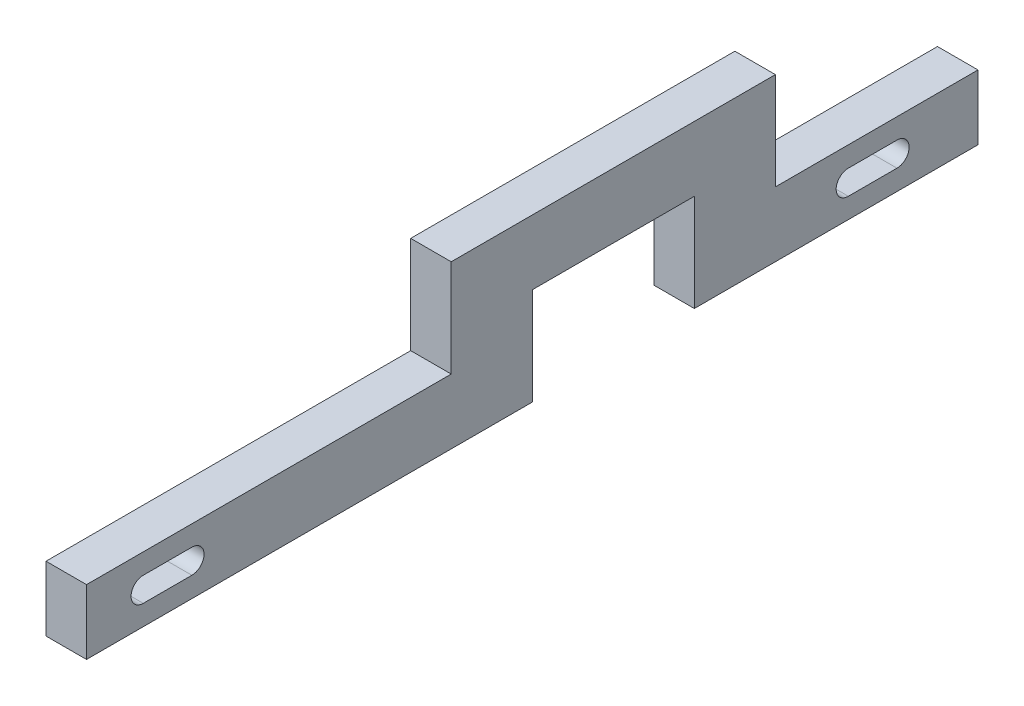
ISO-10303-21;
HEADER;
FILE_DESCRIPTION(('STEP AP214'),'2;1');
FILE_NAME('part.step','',(''),(''),'','','');
FILE_SCHEMA(('AUTOMOTIVE_DESIGN { 1 0 10303 214 1 1 1 1 }'));
ENDSEC;
DATA;
#1=APPLICATION_CONTEXT('core data for automotive mechanical design processes');
#2=APPLICATION_PROTOCOL_DEFINITION('international standard','automotive_design',2000,#1);
#3=PRODUCT_CONTEXT('',#1,'mechanical');
#4=PRODUCT('Part','Part','',(#3));
#5=PRODUCT_RELATED_PRODUCT_CATEGORY('part','',(#4));
#6=PRODUCT_DEFINITION_FORMATION('','',#4);
#7=PRODUCT_DEFINITION_CONTEXT('part definition',#1,'design');
#8=PRODUCT_DEFINITION('design','',#6,#7);
#9=PRODUCT_DEFINITION_SHAPE('','',#8);
#10=(LENGTH_UNIT() NAMED_UNIT(*) SI_UNIT(.MILLI.,.METRE.));
#11=(NAMED_UNIT(*) PLANE_ANGLE_UNIT() SI_UNIT($,.RADIAN.));
#12=(NAMED_UNIT(*) SI_UNIT($,.STERADIAN.) SOLID_ANGLE_UNIT());
#13=UNCERTAINTY_MEASURE_WITH_UNIT(LENGTH_MEASURE(1.E-05),#10,'distance_accuracy_value','');
#14=(GEOMETRIC_REPRESENTATION_CONTEXT(3) GLOBAL_UNCERTAINTY_ASSIGNED_CONTEXT((#13)) GLOBAL_UNIT_ASSIGNED_CONTEXT((#10,
#11,#12)) REPRESENTATION_CONTEXT('',''));
#15=CARTESIAN_POINT('',(0.,0.,0.));
#16=DIRECTION('',(0.,0.,1.));
#17=DIRECTION('',(1.,0.,0.));
#18=AXIS2_PLACEMENT_3D('',#15,#16,#17);
#19=CARTESIAN_POINT('',(5.,0.,0.));
#20=DIRECTION('',(1.,0.,0.));
#21=DIRECTION('',(0.,0.,-1.));
#22=AXIS2_PLACEMENT_3D('',#19,#20,#21);
#23=PLANE('',#22);
#24=DIRECTION('',(0.,-1.,0.));
#25=VECTOR('',#24,1.);
#26=CARTESIAN_POINT('',(5.,7.81238305983361,30.4077186591871));
#27=LINE('',#26,#25);
#28=CARTESIAN_POINT('',(5.,7.81238305983361,30.4077186591871));
#29=VERTEX_POINT('',#28);
#30=CARTESIAN_POINT('',(5.,-0.187616940166392,30.4077186591871));
#31=VERTEX_POINT('',#30);
#32=EDGE_CURVE('E268',#29,#31,#27,.T.);
#33=ORIENTED_EDGE('',*,*,#32,.T.);
#34=DIRECTION('',(0.,0.,-1.));
#35=VECTOR('',#34,1.);
#36=CARTESIAN_POINT('',(5.,-0.187616940166392,30.4077186591871));
#37=LINE('',#36,#35);
#38=CARTESIAN_POINT('',(5.,-0.187616940166392,-24.5922813408129));
#39=VERTEX_POINT('',#38);
#40=EDGE_CURVE('E272',#31,#39,#37,.T.);
#41=ORIENTED_EDGE('',*,*,#40,.T.);
#42=DIRECTION('',(0.,1.,0.));
#43=VECTOR('',#42,1.);
#44=CARTESIAN_POINT('',(5.,3.81238305983362,-24.5922813408129));
#45=LINE('',#44,#43);
#46=CARTESIAN_POINT('',(5.,11.8123830598336,-24.5922813408129));
#47=VERTEX_POINT('',#46);
#48=EDGE_CURVE('E276',#39,#47,#45,.T.);
#49=ORIENTED_EDGE('',*,*,#48,.T.);
#50=DIRECTION('',(0.,0.,-1.));
#51=VECTOR('',#50,1.);
#52=CARTESIAN_POINT('',(5.,11.8123830598336,-44.5922813408129));
#53=LINE('',#52,#51);
#54=CARTESIAN_POINT('',(5.,11.8123830598336,-44.5922813408129));
#55=VERTEX_POINT('',#54);
#56=EDGE_CURVE('E279',#47,#55,#53,.T.);
#57=ORIENTED_EDGE('',*,*,#56,.T.);
#58=DIRECTION('',(0.,-1.,0.));
#59=VECTOR('',#58,1.);
#60=CARTESIAN_POINT('',(5.,7.81238305983361,-44.5922813408129));
#61=LINE('',#60,#59);
#62=CARTESIAN_POINT('',(5.,-0.187616940166392,-44.5922813408129));
#63=VERTEX_POINT('',#62);
#64=EDGE_CURVE('E282',#55,#63,#61,.T.);
#65=ORIENTED_EDGE('',*,*,#64,.T.);
#66=DIRECTION('',(0.,0.,-1.));
#67=VECTOR('',#66,1.);
#68=CARTESIAN_POINT('',(5.,-0.187616940166392,-44.5922813408129));
#69=LINE('',#68,#67);
#70=CARTESIAN_POINT('',(5.,-0.187616940166392,-79.5922813408129));
#71=VERTEX_POINT('',#70);
#72=EDGE_CURVE('E285',#63,#71,#69,.T.);
#73=ORIENTED_EDGE('',*,*,#72,.T.);
#74=DIRECTION('',(0.,1.,0.));
#75=VECTOR('',#74,1.);
#76=CARTESIAN_POINT('',(5.,7.81238305983361,-79.5922813408129));
#77=LINE('',#76,#75);
#78=CARTESIAN_POINT('',(5.,7.81238305983361,-79.5922813408129));
#79=VERTEX_POINT('',#78);
#80=EDGE_CURVE('E288',#71,#79,#77,.T.);
#81=ORIENTED_EDGE('',*,*,#80,.T.);
#82=DIRECTION('',(0.,0.,1.));
#83=VECTOR('',#82,1.);
#84=CARTESIAN_POINT('',(5.,7.81238305983361,-54.5922813408129));
#85=LINE('',#84,#83);
#86=CARTESIAN_POINT('',(5.,7.81238305983361,-54.5922813408129));
#87=VERTEX_POINT('',#86);
#88=EDGE_CURVE('E291',#79,#87,#85,.T.);
#89=ORIENTED_EDGE('',*,*,#88,.T.);
#90=DIRECTION('',(0.,1.,0.));
#91=VECTOR('',#90,1.);
#92=CARTESIAN_POINT('',(5.,7.81238305983361,-54.5922813408129));
#93=LINE('',#92,#91);
#94=CARTESIAN_POINT('',(5.,19.8123830598336,-54.5922813408129));
#95=VERTEX_POINT('',#94);
#96=EDGE_CURVE('E294',#87,#95,#93,.T.);
#97=ORIENTED_EDGE('',*,*,#96,.T.);
#98=DIRECTION('',(0.,0.,1.));
#99=VECTOR('',#98,1.);
#100=CARTESIAN_POINT('',(5.,19.8123830598336,-54.5922813408129));
#101=LINE('',#100,#99);
#102=CARTESIAN_POINT('',(5.,19.8123830598336,-14.5922813408129));
#103=VERTEX_POINT('',#102);
#104=EDGE_CURVE('E297',#95,#103,#101,.T.);
#105=ORIENTED_EDGE('',*,*,#104,.T.);
#106=DIRECTION('',(0.,-1.,0.));
#107=VECTOR('',#106,1.);
#108=CARTESIAN_POINT('',(5.,7.81238305983361,-14.5922813408129));
#109=LINE('',#108,#107);
#110=CARTESIAN_POINT('',(5.,7.81238305983361,-14.5922813408129));
#111=VERTEX_POINT('',#110);
#112=EDGE_CURVE('E300',#103,#111,#109,.T.);
#113=ORIENTED_EDGE('',*,*,#112,.T.);
#114=DIRECTION('',(0.,0.,1.));
#115=VECTOR('',#114,1.);
#116=CARTESIAN_POINT('',(5.,7.81238305983361,30.4077186591871));
#117=LINE('',#116,#115);
#118=EDGE_CURVE('E303',#111,#29,#117,.T.);
#119=ORIENTED_EDGE('',*,*,#118,.T.);
#120=EDGE_LOOP('',(#33,#41,#49,#57,#65,#73,#81,#89,#97,#105,#113,#119));
#121=FACE_BOUND('',#120,.T.);
#122=DIRECTION('',(0.,0.,-1.));
#123=VECTOR('',#122,1.);
#124=CARTESIAN_POINT('',(5.,2.31238305983361,23.4077186591871));
#125=LINE('',#124,#123);
#126=CARTESIAN_POINT('',(5.,2.31238305983361,23.4077186591871));
#127=VERTEX_POINT('',#126);
#128=CARTESIAN_POINT('',(5.,2.3123830598336,17.4077186591871));
#129=VERTEX_POINT('',#128);
#130=EDGE_CURVE('E228',#127,#129,#125,.T.);
#131=ORIENTED_EDGE('',*,*,#130,.F.);
#132=CARTESIAN_POINT('',(5.,3.81238305983361,23.4077186591871));
#133=DIRECTION('',(1.,0.,0.));
#134=DIRECTION('',(0.,0.,-1.));
#135=AXIS2_PLACEMENT_3D('',#132,#133,#134);
#136=CIRCLE('',#135,1.5);
#137=CARTESIAN_POINT('',(5.,5.31238305983361,23.4077186591871));
#138=VERTEX_POINT('',#137);
#139=EDGE_CURVE('E225',#138,#127,#136,.T.);
#140=ORIENTED_EDGE('',*,*,#139,.F.);
#141=DIRECTION('',(0.,0.,1.));
#142=VECTOR('',#141,1.);
#143=CARTESIAN_POINT('',(5.,5.31238305983361,23.4077186591871));
#144=LINE('',#143,#142);
#145=CARTESIAN_POINT('',(5.,5.31238305983361,17.4077186591871));
#146=VERTEX_POINT('',#145);
#147=EDGE_CURVE('E236',#146,#138,#144,.T.);
#148=ORIENTED_EDGE('',*,*,#147,.F.);
#149=CARTESIAN_POINT('',(5.,3.8123830598336,17.4077186591871));
#150=DIRECTION('',(1.,0.,0.));
#151=DIRECTION('',(0.,0.,-1.));
#152=AXIS2_PLACEMENT_3D('',#149,#150,#151);
#153=CIRCLE('',#152,1.5);
#154=EDGE_CURVE('E232',#129,#146,#153,.T.);
#155=ORIENTED_EDGE('',*,*,#154,.F.);
#156=EDGE_LOOP('',(#131,#140,#148,#155));
#157=FACE_BOUND('',#156,.T.);
#158=DIRECTION('',(0.,0.,1.));
#159=VECTOR('',#158,1.);
#160=CARTESIAN_POINT('',(5.,5.31238305983362,-69.5922813408129));
#161=LINE('',#160,#159);
#162=CARTESIAN_POINT('',(5.,5.31238305983362,-69.5922813408129));
#163=VERTEX_POINT('',#162);
#164=CARTESIAN_POINT('',(5.,5.31238305983362,-63.5922813408129));
#165=VERTEX_POINT('',#164);
#166=EDGE_CURVE('E186',#163,#165,#161,.T.);
#167=ORIENTED_EDGE('',*,*,#166,.F.);
#168=CARTESIAN_POINT('',(5.,3.81238305983362,-69.5922813408129));
#169=DIRECTION('',(1.,0.,0.));
#170=DIRECTION('',(0.,0.,-1.));
#171=AXIS2_PLACEMENT_3D('',#168,#169,#170);
#172=CIRCLE('',#171,1.5);
#173=CARTESIAN_POINT('',(5.,2.31238305983362,-69.5922813408129));
#174=VERTEX_POINT('',#173);
#175=EDGE_CURVE('E177',#174,#163,#172,.T.);
#176=ORIENTED_EDGE('',*,*,#175,.F.);
#177=DIRECTION('',(0.,0.,-1.));
#178=VECTOR('',#177,1.);
#179=CARTESIAN_POINT('',(5.,2.31238305983362,-69.5922813408129));
#180=LINE('',#179,#178);
#181=CARTESIAN_POINT('',(5.,2.31238305983362,-63.5922813408129));
#182=VERTEX_POINT('',#181);
#183=EDGE_CURVE('E203',#182,#174,#180,.T.);
#184=ORIENTED_EDGE('',*,*,#183,.F.);
#185=CARTESIAN_POINT('',(5.,3.81238305983362,-63.5922813408129));
#186=DIRECTION('',(1.,0.,0.));
#187=DIRECTION('',(0.,0.,-1.));
#188=AXIS2_PLACEMENT_3D('',#185,#186,#187);
#189=CIRCLE('',#188,1.5);
#190=EDGE_CURVE('E199',#165,#182,#189,.T.);
#191=ORIENTED_EDGE('',*,*,#190,.F.);
#192=EDGE_LOOP('',(#167,#176,#184,#191));
#193=FACE_BOUND('',#192,.T.);
#194=ADVANCED_FACE('F39',(#121,#157,#193),#23,.T.);
#195=CARTESIAN_POINT('',(0.,0.,0.));
#196=DIRECTION('',(1.,0.,0.));
#197=DIRECTION('',(0.,0.,-1.));
#198=AXIS2_PLACEMENT_3D('',#195,#196,#197);
#199=PLANE('',#198);
#200=CARTESIAN_POINT('',(0.,3.81238305983361,23.4077186591871));
#201=DIRECTION('',(1.,0.,0.));
#202=DIRECTION('',(0.,0.,-1.));
#203=AXIS2_PLACEMENT_3D('',#200,#201,#202);
#204=CIRCLE('',#203,1.5);
#205=CARTESIAN_POINT('',(0.,5.31238305983361,23.4077186591871));
#206=VERTEX_POINT('',#205);
#207=CARTESIAN_POINT('',(0.,2.31238305983361,23.4077186591871));
#208=VERTEX_POINT('',#207);
#209=EDGE_CURVE('E195',#206,#208,#204,.T.);
#210=ORIENTED_EDGE('',*,*,#209,.T.);
#211=DIRECTION('',(0.,0.,-1.));
#212=VECTOR('',#211,1.);
#213=CARTESIAN_POINT('',(0.,2.31238305983361,23.4077186591871));
#214=LINE('',#213,#212);
#215=CARTESIAN_POINT('',(0.,2.3123830598336,17.4077186591871));
#216=VERTEX_POINT('',#215);
#217=EDGE_CURVE('E243',#208,#216,#214,.T.);
#218=ORIENTED_EDGE('',*,*,#217,.T.);
#219=CARTESIAN_POINT('',(0.,3.8123830598336,17.4077186591871));
#220=DIRECTION('',(1.,0.,0.));
#221=DIRECTION('',(0.,0.,-1.));
#222=AXIS2_PLACEMENT_3D('',#219,#220,#221);
#223=CIRCLE('',#222,1.5);
#224=CARTESIAN_POINT('',(0.,5.31238305983361,17.4077186591871));
#225=VERTEX_POINT('',#224);
#226=EDGE_CURVE('E247',#216,#225,#223,.T.);
#227=ORIENTED_EDGE('',*,*,#226,.T.);
#228=DIRECTION('',(0.,0.,1.));
#229=VECTOR('',#228,1.);
#230=CARTESIAN_POINT('',(0.,5.31238305983361,23.4077186591871));
#231=LINE('',#230,#229);
#232=EDGE_CURVE('E229',#225,#206,#231,.T.);
#233=ORIENTED_EDGE('',*,*,#232,.T.);
#234=EDGE_LOOP('',(#210,#218,#227,#233));
#235=FACE_BOUND('',#234,.T.);
#236=DIRECTION('',(0.,-1.,0.));
#237=VECTOR('',#236,1.);
#238=CARTESIAN_POINT('',(0.,7.81238305983361,30.4077186591871));
#239=LINE('',#238,#237);
#240=CARTESIAN_POINT('',(0.,7.81238305983361,30.4077186591871));
#241=VERTEX_POINT('',#240);
#242=CARTESIAN_POINT('',(0.,-0.187616940166392,30.4077186591871));
#243=VERTEX_POINT('',#242);
#244=EDGE_CURVE('E267',#241,#243,#239,.T.);
#245=ORIENTED_EDGE('',*,*,#244,.F.);
#246=DIRECTION('',(0.,0.,1.));
#247=VECTOR('',#246,1.);
#248=CARTESIAN_POINT('',(0.,7.81238305983361,30.4077186591871));
#249=LINE('',#248,#247);
#250=CARTESIAN_POINT('',(0.,7.81238305983361,-14.5922813408129));
#251=VERTEX_POINT('',#250);
#252=EDGE_CURVE('E273',#251,#241,#249,.T.);
#253=ORIENTED_EDGE('',*,*,#252,.F.);
#254=DIRECTION('',(0.,-1.,0.));
#255=VECTOR('',#254,1.);
#256=CARTESIAN_POINT('',(0.,7.81238305983361,-14.5922813408129));
#257=LINE('',#256,#255);
#258=CARTESIAN_POINT('',(0.,19.8123830598336,-14.5922813408129));
#259=VERTEX_POINT('',#258);
#260=EDGE_CURVE('E339',#259,#251,#257,.T.);
#261=ORIENTED_EDGE('',*,*,#260,.F.);
#262=DIRECTION('',(0.,0.,1.));
#263=VECTOR('',#262,1.);
#264=CARTESIAN_POINT('',(0.,19.8123830598336,-54.5922813408129));
#265=LINE('',#264,#263);
#266=CARTESIAN_POINT('',(0.,19.8123830598336,-54.5922813408129));
#267=VERTEX_POINT('',#266);
#268=EDGE_CURVE('E336',#267,#259,#265,.T.);
#269=ORIENTED_EDGE('',*,*,#268,.F.);
#270=DIRECTION('',(0.,1.,0.));
#271=VECTOR('',#270,1.);
#272=CARTESIAN_POINT('',(0.,7.81238305983361,-54.5922813408129));
#273=LINE('',#272,#271);
#274=CARTESIAN_POINT('',(0.,7.81238305983361,-54.5922813408129));
#275=VERTEX_POINT('',#274);
#276=EDGE_CURVE('E333',#275,#267,#273,.T.);
#277=ORIENTED_EDGE('',*,*,#276,.F.);
#278=DIRECTION('',(0.,0.,1.));
#279=VECTOR('',#278,1.);
#280=CARTESIAN_POINT('',(0.,7.81238305983361,-54.5922813408129));
#281=LINE('',#280,#279);
#282=CARTESIAN_POINT('',(0.,7.81238305983361,-79.5922813408129));
#283=VERTEX_POINT('',#282);
#284=EDGE_CURVE('E330',#283,#275,#281,.T.);
#285=ORIENTED_EDGE('',*,*,#284,.F.);
#286=DIRECTION('',(0.,1.,0.));
#287=VECTOR('',#286,1.);
#288=CARTESIAN_POINT('',(0.,7.81238305983361,-79.5922813408129));
#289=LINE('',#288,#287);
#290=CARTESIAN_POINT('',(0.,-0.187616940166392,-79.5922813408129));
#291=VERTEX_POINT('',#290);
#292=EDGE_CURVE('E327',#291,#283,#289,.T.);
#293=ORIENTED_EDGE('',*,*,#292,.F.);
#294=DIRECTION('',(0.,0.,-1.));
#295=VECTOR('',#294,1.);
#296=CARTESIAN_POINT('',(0.,-0.187616940166392,-44.5922813408129));
#297=LINE('',#296,#295);
#298=CARTESIAN_POINT('',(0.,-0.187616940166392,-44.5922813408129));
#299=VERTEX_POINT('',#298);
#300=EDGE_CURVE('E324',#299,#291,#297,.T.);
#301=ORIENTED_EDGE('',*,*,#300,.F.);
#302=DIRECTION('',(0.,-1.,0.));
#303=VECTOR('',#302,1.);
#304=CARTESIAN_POINT('',(0.,7.81238305983361,-44.5922813408129));
#305=LINE('',#304,#303);
#306=CARTESIAN_POINT('',(0.,11.8123830598336,-44.5922813408129));
#307=VERTEX_POINT('',#306);
#308=EDGE_CURVE('E321',#307,#299,#305,.T.);
#309=ORIENTED_EDGE('',*,*,#308,.F.);
#310=DIRECTION('',(0.,0.,-1.));
#311=VECTOR('',#310,1.);
#312=CARTESIAN_POINT('',(0.,11.8123830598336,-44.5922813408129));
#313=LINE('',#312,#311);
#314=CARTESIAN_POINT('',(0.,11.8123830598336,-24.5922813408129));
#315=VERTEX_POINT('',#314);
#316=EDGE_CURVE('E317',#315,#307,#313,.T.);
#317=ORIENTED_EDGE('',*,*,#316,.F.);
#318=DIRECTION('',(0.,1.,0.));
#319=VECTOR('',#318,1.);
#320=CARTESIAN_POINT('',(0.,11.8123830598336,-24.5922813408129));
#321=LINE('',#320,#319);
#322=CARTESIAN_POINT('',(0.,-0.187616940166392,-24.5922813408129));
#323=VERTEX_POINT('',#322);
#324=EDGE_CURVE('E314',#323,#315,#321,.T.);
#325=ORIENTED_EDGE('',*,*,#324,.F.);
#326=DIRECTION('',(0.,0.,-1.));
#327=VECTOR('',#326,1.);
#328=CARTESIAN_POINT('',(0.,-0.187616940166392,30.4077186591871));
#329=LINE('',#328,#327);
#330=EDGE_CURVE('E310',#243,#323,#329,.T.);
#331=ORIENTED_EDGE('',*,*,#330,.F.);
#332=EDGE_LOOP('',(#245,#253,#261,#269,#277,#285,#293,#301,#309,#317,#325,#331));
#333=FACE_BOUND('',#332,.T.);
#334=CARTESIAN_POINT('',(0.,3.81238305983362,-69.5922813408129));
#335=DIRECTION('',(1.,0.,0.));
#336=DIRECTION('',(0.,0.,-1.));
#337=AXIS2_PLACEMENT_3D('',#334,#335,#336);
#338=CIRCLE('',#337,1.5);
#339=CARTESIAN_POINT('',(0.,2.31238305983362,-69.5922813408129));
#340=VERTEX_POINT('',#339);
#341=CARTESIAN_POINT('',(0.,5.31238305983362,-69.5922813408129));
#342=VERTEX_POINT('',#341);
#343=EDGE_CURVE('E63',#340,#342,#338,.T.);
#344=ORIENTED_EDGE('',*,*,#343,.T.);
#345=DIRECTION('',(0.,0.,1.));
#346=VECTOR('',#345,1.);
#347=CARTESIAN_POINT('',(0.,5.31238305983362,-69.5922813408129));
#348=LINE('',#347,#346);
#349=CARTESIAN_POINT('',(0.,5.31238305983362,-63.5922813408129));
#350=VERTEX_POINT('',#349);
#351=EDGE_CURVE('E193',#342,#350,#348,.T.);
#352=ORIENTED_EDGE('',*,*,#351,.T.);
#353=CARTESIAN_POINT('',(0.,3.81238305983362,-63.5922813408129));
#354=DIRECTION('',(1.,0.,0.));
#355=DIRECTION('',(0.,0.,-1.));
#356=AXIS2_PLACEMENT_3D('',#353,#354,#355);
#357=CIRCLE('',#356,1.5);
#358=CARTESIAN_POINT('',(0.,2.31238305983362,-63.5922813408129));
#359=VERTEX_POINT('',#358);
#360=EDGE_CURVE('E212',#350,#359,#357,.T.);
#361=ORIENTED_EDGE('',*,*,#360,.T.);
#362=DIRECTION('',(0.,0.,-1.));
#363=VECTOR('',#362,1.);
#364=CARTESIAN_POINT('',(0.,2.31238305983362,-69.5922813408129));
#365=LINE('',#364,#363);
#366=EDGE_CURVE('E187',#359,#340,#365,.T.);
#367=ORIENTED_EDGE('',*,*,#366,.T.);
#368=EDGE_LOOP('',(#344,#352,#361,#367));
#369=FACE_BOUND('',#368,.T.);
#370=ADVANCED_FACE('F394',(#235,#333,#369),#199,.F.);
#371=CARTESIAN_POINT('',(5.,7.81238305983361,30.4077186591871));
#372=DIRECTION('',(0.,0.,-1.));
#373=DIRECTION('',(-1.,0.,0.));
#374=AXIS2_PLACEMENT_3D('',#371,#372,#373);
#375=PLANE('',#374);
#376=ORIENTED_EDGE('',*,*,#244,.T.);
#377=DIRECTION('',(-1.,0.,0.));
#378=VECTOR('',#377,1.);
#379=CARTESIAN_POINT('',(5.,-0.187616940166392,30.4077186591871));
#380=LINE('',#379,#378);
#381=EDGE_CURVE('E11',#31,#243,#380,.T.);
#382=ORIENTED_EDGE('',*,*,#381,.F.);
#383=ORIENTED_EDGE('',*,*,#32,.F.);
#384=DIRECTION('',(-1.,0.,0.));
#385=VECTOR('',#384,1.);
#386=CARTESIAN_POINT('',(5.,7.81238305983361,30.4077186591871));
#387=LINE('',#386,#385);
#388=EDGE_CURVE('E306',#29,#241,#387,.T.);
#389=ORIENTED_EDGE('',*,*,#388,.T.);
#390=EDGE_LOOP('',(#376,#382,#383,#389));
#391=FACE_BOUND('',#390,.T.);
#392=ADVANCED_FACE('F41',(#391),#375,.F.);
#393=CARTESIAN_POINT('',(5.,-0.187616940166392,30.4077186591871));
#394=DIRECTION('',(0.,1.,0.));
#395=DIRECTION('',(0.,0.,1.));
#396=AXIS2_PLACEMENT_3D('',#393,#394,#395);
#397=PLANE('',#396);
#398=ORIENTED_EDGE('',*,*,#330,.T.);
#399=DIRECTION('',(-1.,0.,0.));
#400=VECTOR('',#399,1.);
#401=CARTESIAN_POINT('',(5.,-0.187616940166392,-24.5922813408129));
#402=LINE('',#401,#400);
#403=EDGE_CURVE('E48',#39,#323,#402,.T.);
#404=ORIENTED_EDGE('',*,*,#403,.F.);
#405=ORIENTED_EDGE('',*,*,#40,.F.);
#406=ORIENTED_EDGE('',*,*,#381,.T.);
#407=EDGE_LOOP('',(#398,#404,#405,#406));
#408=FACE_BOUND('',#407,.T.);
#409=ADVANCED_FACE('F390',(#408),#397,.F.);
#410=CARTESIAN_POINT('',(5.,11.8123830598336,-24.5922813408129));
#411=DIRECTION('',(0.,0.,1.));
#412=DIRECTION('',(0.,-1.,0.));
#413=AXIS2_PLACEMENT_3D('',#410,#411,#412);
#414=PLANE('',#413);
#415=ORIENTED_EDGE('',*,*,#324,.T.);
#416=DIRECTION('',(-1.,0.,0.));
#417=VECTOR('',#416,1.);
#418=CARTESIAN_POINT('',(5.,11.8123830598336,-24.5922813408129));
#419=LINE('',#418,#417);
#420=EDGE_CURVE('E379',#47,#315,#419,.T.);
#421=ORIENTED_EDGE('',*,*,#420,.F.);
#422=ORIENTED_EDGE('',*,*,#48,.F.);
#423=ORIENTED_EDGE('',*,*,#403,.T.);
#424=EDGE_LOOP('',(#415,#421,#422,#423));
#425=FACE_BOUND('',#424,.T.);
#426=ADVANCED_FACE('F387',(#425),#414,.F.);
#427=CARTESIAN_POINT('',(5.,11.8123830598336,-44.5922813408129));
#428=DIRECTION('',(0.,1.,0.));
#429=DIRECTION('',(0.,0.,1.));
#430=AXIS2_PLACEMENT_3D('',#427,#428,#429);
#431=PLANE('',#430);
#432=ORIENTED_EDGE('',*,*,#316,.T.);
#433=DIRECTION('',(-1.,0.,0.));
#434=VECTOR('',#433,1.);
#435=CARTESIAN_POINT('',(5.,11.8123830598336,-44.5922813408129));
#436=LINE('',#435,#434);
#437=EDGE_CURVE('E375',#55,#307,#436,.T.);
#438=ORIENTED_EDGE('',*,*,#437,.F.);
#439=ORIENTED_EDGE('',*,*,#56,.F.);
#440=ORIENTED_EDGE('',*,*,#420,.T.);
#441=EDGE_LOOP('',(#432,#438,#439,#440));
#442=FACE_BOUND('',#441,.T.);
#443=ADVANCED_FACE('F401',(#442),#431,.F.);
#444=CARTESIAN_POINT('',(5.,7.81238305983361,-44.5922813408129));
#445=DIRECTION('',(0.,0.,-1.));
#446=DIRECTION('',(0.,1.,0.));
#447=AXIS2_PLACEMENT_3D('',#444,#445,#446);
#448=PLANE('',#447);
#449=ORIENTED_EDGE('',*,*,#308,.T.);
#450=DIRECTION('',(-1.,0.,0.));
#451=VECTOR('',#450,1.);
#452=CARTESIAN_POINT('',(5.,-0.187616940166392,-44.5922813408129));
#453=LINE('',#452,#451);
#454=EDGE_CURVE('E371',#63,#299,#453,.T.);
#455=ORIENTED_EDGE('',*,*,#454,.F.);
#456=ORIENTED_EDGE('',*,*,#64,.F.);
#457=ORIENTED_EDGE('',*,*,#437,.T.);
#458=EDGE_LOOP('',(#449,#455,#456,#457));
#459=FACE_BOUND('',#458,.T.);
#460=ADVANCED_FACE('F405',(#459),#448,.F.);
#461=CARTESIAN_POINT('',(5.,-0.187616940166392,-44.5922813408129));
#462=DIRECTION('',(0.,1.,0.));
#463=DIRECTION('',(0.,0.,1.));
#464=AXIS2_PLACEMENT_3D('',#461,#462,#463);
#465=PLANE('',#464);
#466=ORIENTED_EDGE('',*,*,#300,.T.);
#467=DIRECTION('',(-1.,0.,0.));
#468=VECTOR('',#467,1.);
#469=CARTESIAN_POINT('',(5.,-0.187616940166392,-79.5922813408129));
#470=LINE('',#469,#468);
#471=EDGE_CURVE('E367',#71,#291,#470,.T.);
#472=ORIENTED_EDGE('',*,*,#471,.F.);
#473=ORIENTED_EDGE('',*,*,#72,.F.);
#474=ORIENTED_EDGE('',*,*,#454,.T.);
#475=EDGE_LOOP('',(#466,#472,#473,#474));
#476=FACE_BOUND('',#475,.T.);
#477=ADVANCED_FACE('F443',(#476),#465,.F.);
#478=CARTESIAN_POINT('',(5.,7.81238305983361,-79.5922813408129));
#479=DIRECTION('',(0.,0.,1.));
#480=DIRECTION('',(1.,0.,0.));
#481=AXIS2_PLACEMENT_3D('',#478,#479,#480);
#482=PLANE('',#481);
#483=ORIENTED_EDGE('',*,*,#292,.T.);
#484=DIRECTION('',(-1.,0.,0.));
#485=VECTOR('',#484,1.);
#486=CARTESIAN_POINT('',(5.,7.81238305983361,-79.5922813408129));
#487=LINE('',#486,#485);
#488=EDGE_CURVE('E363',#79,#283,#487,.T.);
#489=ORIENTED_EDGE('',*,*,#488,.F.);
#490=ORIENTED_EDGE('',*,*,#80,.F.);
#491=ORIENTED_EDGE('',*,*,#471,.T.);
#492=EDGE_LOOP('',(#483,#489,#490,#491));
#493=FACE_BOUND('',#492,.T.);
#494=ADVANCED_FACE('F441',(#493),#482,.F.);
#495=CARTESIAN_POINT('',(5.,7.81238305983361,-54.5922813408129));
#496=DIRECTION('',(0.,-1.,0.));
#497=DIRECTION('',(0.,0.,-1.));
#498=AXIS2_PLACEMENT_3D('',#495,#496,#497);
#499=PLANE('',#498);
#500=ORIENTED_EDGE('',*,*,#284,.T.);
#501=DIRECTION('',(-1.,0.,0.));
#502=VECTOR('',#501,1.);
#503=CARTESIAN_POINT('',(5.,7.81238305983361,-54.5922813408129));
#504=LINE('',#503,#502);
#505=EDGE_CURVE('E359',#87,#275,#504,.T.);
#506=ORIENTED_EDGE('',*,*,#505,.F.);
#507=ORIENTED_EDGE('',*,*,#88,.F.);
#508=ORIENTED_EDGE('',*,*,#488,.T.);
#509=EDGE_LOOP('',(#500,#506,#507,#508));
#510=FACE_BOUND('',#509,.T.);
#511=ADVANCED_FACE('F436',(#510),#499,.F.);
#512=CARTESIAN_POINT('',(5.,7.81238305983361,-54.5922813408129));
#513=DIRECTION('',(0.,0.,1.));
#514=DIRECTION('',(1.,0.,0.));
#515=AXIS2_PLACEMENT_3D('',#512,#513,#514);
#516=PLANE('',#515);
#517=ORIENTED_EDGE('',*,*,#276,.T.);
#518=DIRECTION('',(-1.,0.,0.));
#519=VECTOR('',#518,1.);
#520=CARTESIAN_POINT('',(5.,19.8123830598336,-54.5922813408129));
#521=LINE('',#520,#519);
#522=EDGE_CURVE('E355',#95,#267,#521,.T.);
#523=ORIENTED_EDGE('',*,*,#522,.F.);
#524=ORIENTED_EDGE('',*,*,#96,.F.);
#525=ORIENTED_EDGE('',*,*,#505,.T.);
#526=EDGE_LOOP('',(#517,#523,#524,#525));
#527=FACE_BOUND('',#526,.T.);
#528=ADVANCED_FACE('F431',(#527),#516,.F.);
#529=CARTESIAN_POINT('',(5.,19.8123830598336,-54.5922813408129));
#530=DIRECTION('',(0.,-1.,0.));
#531=DIRECTION('',(0.,0.,-1.));
#532=AXIS2_PLACEMENT_3D('',#529,#530,#531);
#533=PLANE('',#532);
#534=ORIENTED_EDGE('',*,*,#268,.T.);
#535=DIRECTION('',(-1.,0.,0.));
#536=VECTOR('',#535,1.);
#537=CARTESIAN_POINT('',(5.,19.8123830598336,-14.5922813408129));
#538=LINE('',#537,#536);
#539=EDGE_CURVE('E351',#103,#259,#538,.T.);
#540=ORIENTED_EDGE('',*,*,#539,.F.);
#541=ORIENTED_EDGE('',*,*,#104,.F.);
#542=ORIENTED_EDGE('',*,*,#522,.T.);
#543=EDGE_LOOP('',(#534,#540,#541,#542));
#544=FACE_BOUND('',#543,.T.);
#545=ADVANCED_FACE('F427',(#544),#533,.F.);
#546=CARTESIAN_POINT('',(5.,7.81238305983361,-14.5922813408129));
#547=DIRECTION('',(0.,0.,-1.));
#548=DIRECTION('',(-1.,0.,0.));
#549=AXIS2_PLACEMENT_3D('',#546,#547,#548);
#550=PLANE('',#549);
#551=ORIENTED_EDGE('',*,*,#260,.T.);
#552=DIRECTION('',(-1.,0.,0.));
#553=VECTOR('',#552,1.);
#554=CARTESIAN_POINT('',(5.,7.81238305983361,-14.5922813408129));
#555=LINE('',#554,#553);
#556=EDGE_CURVE('E347',#111,#251,#555,.T.);
#557=ORIENTED_EDGE('',*,*,#556,.F.);
#558=ORIENTED_EDGE('',*,*,#112,.F.);
#559=ORIENTED_EDGE('',*,*,#539,.T.);
#560=EDGE_LOOP('',(#551,#557,#558,#559));
#561=FACE_BOUND('',#560,.T.);
#562=ADVANCED_FACE('F422',(#561),#550,.F.);
#563=CARTESIAN_POINT('',(5.,7.81238305983361,30.4077186591871));
#564=DIRECTION('',(0.,-1.,0.));
#565=DIRECTION('',(0.,0.,-1.));
#566=AXIS2_PLACEMENT_3D('',#563,#564,#565);
#567=PLANE('',#566);
#568=ORIENTED_EDGE('',*,*,#252,.T.);
#569=ORIENTED_EDGE('',*,*,#388,.F.);
#570=ORIENTED_EDGE('',*,*,#118,.F.);
#571=ORIENTED_EDGE('',*,*,#556,.T.);
#572=EDGE_LOOP('',(#568,#569,#570,#571));
#573=FACE_BOUND('',#572,.T.);
#574=ADVANCED_FACE('F416',(#573),#567,.F.);
#575=CARTESIAN_POINT('',(5.,3.81238305983361,23.4077186591871));
#576=DIRECTION('',(-1.,0.,0.));
#577=DIRECTION('',(0.,0.,1.));
#578=AXIS2_PLACEMENT_3D('',#575,#576,#577);
#579=CYLINDRICAL_SURFACE('',#578,1.5);
#580=ORIENTED_EDGE('',*,*,#209,.F.);
#581=DIRECTION('',(-1.,0.,0.));
#582=VECTOR('',#581,1.);
#583=CARTESIAN_POINT('',(5.,5.31238305983361,23.4077186591871));
#584=LINE('',#583,#582);
#585=EDGE_CURVE('E239',#138,#206,#584,.T.);
#586=ORIENTED_EDGE('',*,*,#585,.F.);
#587=ORIENTED_EDGE('',*,*,#139,.T.);
#588=DIRECTION('',(-1.,0.,0.));
#589=VECTOR('',#588,1.);
#590=CARTESIAN_POINT('',(5.,2.31238305983361,23.4077186591871));
#591=LINE('',#590,#589);
#592=EDGE_CURVE('E263',#127,#208,#591,.T.);
#593=ORIENTED_EDGE('',*,*,#592,.T.);
#594=EDGE_LOOP('',(#580,#586,#587,#593));
#595=FACE_BOUND('',#594,.T.);
#596=ADVANCED_FACE('F460',(#595),#579,.F.);
#597=CARTESIAN_POINT('',(5.,2.31238305983361,23.4077186591871));
#598=DIRECTION('',(0.,1.,0.));
#599=DIRECTION('',(0.,0.,1.));
#600=AXIS2_PLACEMENT_3D('',#597,#598,#599);
#601=PLANE('',#600);
#602=ORIENTED_EDGE('',*,*,#217,.F.);
#603=ORIENTED_EDGE('',*,*,#592,.F.);
#604=ORIENTED_EDGE('',*,*,#130,.T.);
#605=DIRECTION('',(-1.,0.,0.));
#606=VECTOR('',#605,1.);
#607=CARTESIAN_POINT('',(5.,2.3123830598336,17.4077186591871));
#608=LINE('',#607,#606);
#609=EDGE_CURVE('E260',#129,#216,#608,.T.);
#610=ORIENTED_EDGE('',*,*,#609,.T.);
#611=EDGE_LOOP('',(#602,#603,#604,#610));
#612=FACE_BOUND('',#611,.T.);
#613=ADVANCED_FACE('F498',(#612),#601,.T.);
#614=CARTESIAN_POINT('',(5.,3.8123830598336,17.4077186591871));
#615=DIRECTION('',(-1.,0.,0.));
#616=DIRECTION('',(0.,0.,1.));
#617=AXIS2_PLACEMENT_3D('',#614,#615,#616);
#618=CYLINDRICAL_SURFACE('',#617,1.5);
#619=ORIENTED_EDGE('',*,*,#226,.F.);
#620=ORIENTED_EDGE('',*,*,#609,.F.);
#621=ORIENTED_EDGE('',*,*,#154,.T.);
#622=DIRECTION('',(-1.,0.,0.));
#623=VECTOR('',#622,1.);
#624=CARTESIAN_POINT('',(5.,5.31238305983361,17.4077186591871));
#625=LINE('',#624,#623);
#626=EDGE_CURVE('E257',#146,#225,#625,.T.);
#627=ORIENTED_EDGE('',*,*,#626,.T.);
#628=EDGE_LOOP('',(#619,#620,#621,#627));
#629=FACE_BOUND('',#628,.T.);
#630=ADVANCED_FACE('F505',(#629),#618,.F.);
#631=CARTESIAN_POINT('',(5.,5.31238305983361,23.4077186591871));
#632=DIRECTION('',(0.,-1.,0.));
#633=DIRECTION('',(0.,0.,-1.));
#634=AXIS2_PLACEMENT_3D('',#631,#632,#633);
#635=PLANE('',#634);
#636=ORIENTED_EDGE('',*,*,#232,.F.);
#637=ORIENTED_EDGE('',*,*,#626,.F.);
#638=ORIENTED_EDGE('',*,*,#147,.T.);
#639=ORIENTED_EDGE('',*,*,#585,.T.);
#640=EDGE_LOOP('',(#636,#637,#638,#639));
#641=FACE_BOUND('',#640,.T.);
#642=ADVANCED_FACE('F512',(#641),#635,.T.);
#643=CARTESIAN_POINT('',(5.,3.81238305983362,-69.5922813408129));
#644=DIRECTION('',(-1.,0.,0.));
#645=DIRECTION('',(0.,0.,1.));
#646=AXIS2_PLACEMENT_3D('',#643,#644,#645);
#647=CYLINDRICAL_SURFACE('',#646,1.5);
#648=ORIENTED_EDGE('',*,*,#343,.F.);
#649=DIRECTION('',(-1.,0.,0.));
#650=VECTOR('',#649,1.);
#651=CARTESIAN_POINT('',(5.,2.31238305983362,-69.5922813408129));
#652=LINE('',#651,#650);
#653=EDGE_CURVE('E181',#174,#340,#652,.T.);
#654=ORIENTED_EDGE('',*,*,#653,.F.);
#655=ORIENTED_EDGE('',*,*,#175,.T.);
#656=DIRECTION('',(-1.,0.,0.));
#657=VECTOR('',#656,1.);
#658=CARTESIAN_POINT('',(5.,5.31238305983362,-69.5922813408129));
#659=LINE('',#658,#657);
#660=EDGE_CURVE('E180',#163,#342,#659,.T.);
#661=ORIENTED_EDGE('',*,*,#660,.T.);
#662=EDGE_LOOP('',(#648,#654,#655,#661));
#663=FACE_BOUND('',#662,.T.);
#664=ADVANCED_FACE('F179',(#663),#647,.F.);
#665=CARTESIAN_POINT('',(5.,5.31238305983362,-69.5922813408129));
#666=DIRECTION('',(0.,-1.,0.));
#667=DIRECTION('',(0.,0.,-1.));
#668=AXIS2_PLACEMENT_3D('',#665,#666,#667);
#669=PLANE('',#668);
#670=ORIENTED_EDGE('',*,*,#351,.F.);
#671=ORIENTED_EDGE('',*,*,#660,.F.);
#672=ORIENTED_EDGE('',*,*,#166,.T.);
#673=DIRECTION('',(-1.,0.,0.));
#674=VECTOR('',#673,1.);
#675=CARTESIAN_POINT('',(5.,5.31238305983362,-63.5922813408129));
#676=LINE('',#675,#674);
#677=EDGE_CURVE('E196',#165,#350,#676,.T.);
#678=ORIENTED_EDGE('',*,*,#677,.T.);
#679=EDGE_LOOP('',(#670,#671,#672,#678));
#680=FACE_BOUND('',#679,.T.);
#681=ADVANCED_FACE('F190',(#680),#669,.T.);
#682=CARTESIAN_POINT('',(5.,3.81238305983362,-63.5922813408129));
#683=DIRECTION('',(-1.,0.,0.));
#684=DIRECTION('',(0.,0.,1.));
#685=AXIS2_PLACEMENT_3D('',#682,#683,#684);
#686=CYLINDRICAL_SURFACE('',#685,1.5);
#687=ORIENTED_EDGE('',*,*,#360,.F.);
#688=ORIENTED_EDGE('',*,*,#677,.F.);
#689=ORIENTED_EDGE('',*,*,#190,.T.);
#690=DIRECTION('',(-1.,0.,0.));
#691=VECTOR('',#690,1.);
#692=CARTESIAN_POINT('',(5.,2.31238305983362,-63.5922813408129));
#693=LINE('',#692,#691);
#694=EDGE_CURVE('E55',#182,#359,#693,.T.);
#695=ORIENTED_EDGE('',*,*,#694,.T.);
#696=EDGE_LOOP('',(#687,#688,#689,#695));
#697=FACE_BOUND('',#696,.T.);
#698=ADVANCED_FACE('F533',(#697),#686,.F.);
#699=CARTESIAN_POINT('',(5.,2.31238305983362,-69.5922813408129));
#700=DIRECTION('',(0.,1.,0.));
#701=DIRECTION('',(0.,0.,1.));
#702=AXIS2_PLACEMENT_3D('',#699,#700,#701);
#703=PLANE('',#702);
#704=ORIENTED_EDGE('',*,*,#366,.F.);
#705=ORIENTED_EDGE('',*,*,#694,.F.);
#706=ORIENTED_EDGE('',*,*,#183,.T.);
#707=ORIENTED_EDGE('',*,*,#653,.T.);
#708=EDGE_LOOP('',(#704,#705,#706,#707));
#709=FACE_BOUND('',#708,.T.);
#710=ADVANCED_FACE('F540',(#709),#703,.T.);
#711=CLOSED_SHELL('',(#194,#370,#392,#409,#426,#443,#460,#477,#494,#511,#528,#545,#562,#574,
#596,#613,#630,#642,#664,#681,#698,#710));
#712=MANIFOLD_SOLID_BREP('B2',#711);
#713=ADVANCED_BREP_SHAPE_REPRESENTATION('',(#18,#712),#14);
#714=SHAPE_DEFINITION_REPRESENTATION(#9,#713);
ENDSEC;
END-ISO-10303-21;
